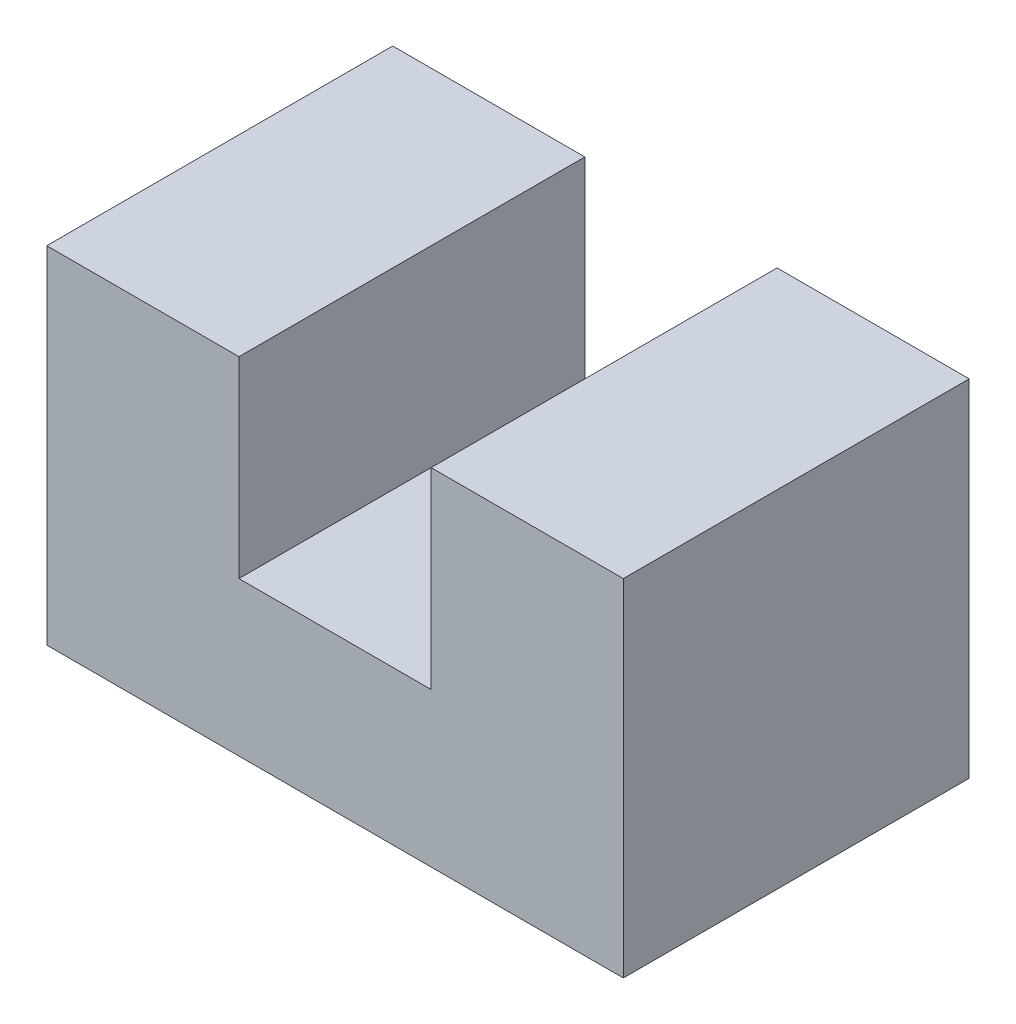
ISO-10303-21;
HEADER;
FILE_DESCRIPTION(('STEP AP214'),'2;1');
FILE_NAME('part.step','',(''),(''),'','','');
FILE_SCHEMA(('AUTOMOTIVE_DESIGN { 1 0 10303 214 1 1 1 1 }'));
ENDSEC;
DATA;
#1=APPLICATION_CONTEXT('core data for automotive mechanical design processes');
#2=APPLICATION_PROTOCOL_DEFINITION('international standard','automotive_design',2000,#1);
#3=PRODUCT_CONTEXT('',#1,'mechanical');
#4=PRODUCT('Part','Part','',(#3));
#5=PRODUCT_RELATED_PRODUCT_CATEGORY('part','',(#4));
#6=PRODUCT_DEFINITION_FORMATION('','',#4);
#7=PRODUCT_DEFINITION_CONTEXT('part definition',#1,'design');
#8=PRODUCT_DEFINITION('design','',#6,#7);
#9=PRODUCT_DEFINITION_SHAPE('','',#8);
#10=(LENGTH_UNIT() NAMED_UNIT(*) SI_UNIT(.MILLI.,.METRE.));
#11=(NAMED_UNIT(*) PLANE_ANGLE_UNIT() SI_UNIT($,.RADIAN.));
#12=(NAMED_UNIT(*) SI_UNIT($,.STERADIAN.) SOLID_ANGLE_UNIT());
#13=UNCERTAINTY_MEASURE_WITH_UNIT(LENGTH_MEASURE(1.E-05),#10,'distance_accuracy_value','');
#14=(GEOMETRIC_REPRESENTATION_CONTEXT(3) GLOBAL_UNCERTAINTY_ASSIGNED_CONTEXT((#13)) GLOBAL_UNIT_ASSIGNED_CONTEXT((#10,
#11,#12)) REPRESENTATION_CONTEXT('',''));
#15=CARTESIAN_POINT('',(0.,0.,0.));
#16=DIRECTION('',(0.,0.,1.));
#17=DIRECTION('',(1.,0.,0.));
#18=AXIS2_PLACEMENT_3D('',#15,#16,#17);
#19=CARTESIAN_POINT('',(0.,60.,30.));
#20=DIRECTION('',(1.,0.,0.));
#21=DIRECTION('',(0.,1.,0.));
#22=AXIS2_PLACEMENT_3D('',#19,#20,#21);
#23=PLANE('',#22);
#24=DIRECTION('',(0.,-1.,0.));
#25=VECTOR('',#24,1.);
#26=CARTESIAN_POINT('',(0.,60.,-30.));
#27=LINE('',#26,#25);
#28=CARTESIAN_POINT('',(0.,60.,-30.));
#29=VERTEX_POINT('',#28);
#30=CARTESIAN_POINT('',(0.,0.,-30.));
#31=VERTEX_POINT('',#30);
#32=EDGE_CURVE('E138',#29,#31,#27,.T.);
#33=ORIENTED_EDGE('',*,*,#32,.T.);
#34=DIRECTION('',(0.,0.,-1.));
#35=VECTOR('',#34,1.);
#36=CARTESIAN_POINT('',(0.,0.,30.));
#37=LINE('',#36,#35);
#38=CARTESIAN_POINT('',(0.,0.,30.));
#39=VERTEX_POINT('',#38);
#40=EDGE_CURVE('E11',#39,#31,#37,.T.);
#41=ORIENTED_EDGE('',*,*,#40,.F.);
#42=DIRECTION('',(0.,-1.,0.));
#43=VECTOR('',#42,1.);
#44=CARTESIAN_POINT('',(0.,60.,30.));
#45=LINE('',#44,#43);
#46=CARTESIAN_POINT('',(0.,60.,30.));
#47=VERTEX_POINT('',#46);
#48=EDGE_CURVE('E160',#47,#39,#45,.T.);
#49=ORIENTED_EDGE('',*,*,#48,.F.);
#50=DIRECTION('',(0.,0.,-1.));
#51=VECTOR('',#50,1.);
#52=CARTESIAN_POINT('',(0.,60.,30.));
#53=LINE('',#52,#51);
#54=EDGE_CURVE('E134',#47,#29,#53,.T.);
#55=ORIENTED_EDGE('',*,*,#54,.T.);
#56=EDGE_LOOP('',(#33,#41,#49,#55));
#57=FACE_BOUND('',#56,.T.);
#58=ADVANCED_FACE('F37',(#57),#23,.F.);
#59=CARTESIAN_POINT('',(0.,0.,30.));
#60=DIRECTION('',(0.,1.,0.));
#61=DIRECTION('',(0.,0.,1.));
#62=AXIS2_PLACEMENT_3D('',#59,#60,#61);
#63=PLANE('',#62);
#64=DIRECTION('',(1.,0.,0.));
#65=VECTOR('',#64,1.);
#66=CARTESIAN_POINT('',(0.,0.,-30.));
#67=LINE('',#66,#65);
#68=CARTESIAN_POINT('',(100.,0.,-30.));
#69=VERTEX_POINT('',#68);
#70=EDGE_CURVE('E142',#31,#69,#67,.T.);
#71=ORIENTED_EDGE('',*,*,#70,.T.);
#72=DIRECTION('',(0.,0.,-1.));
#73=VECTOR('',#72,1.);
#74=CARTESIAN_POINT('',(100.,0.,30.));
#75=LINE('',#74,#73);
#76=CARTESIAN_POINT('',(100.,0.,30.));
#77=VERTEX_POINT('',#76);
#78=EDGE_CURVE('E46',#77,#69,#75,.T.);
#79=ORIENTED_EDGE('',*,*,#78,.F.);
#80=DIRECTION('',(1.,0.,0.));
#81=VECTOR('',#80,1.);
#82=CARTESIAN_POINT('',(0.,0.,30.));
#83=LINE('',#82,#81);
#84=EDGE_CURVE('E97',#39,#77,#83,.T.);
#85=ORIENTED_EDGE('',*,*,#84,.F.);
#86=ORIENTED_EDGE('',*,*,#40,.T.);
#87=EDGE_LOOP('',(#71,#79,#85,#86));
#88=FACE_BOUND('',#87,.T.);
#89=ADVANCED_FACE('F206',(#88),#63,.F.);
#90=CARTESIAN_POINT('',(100.,0.,30.));
#91=DIRECTION('',(-1.,0.,0.));
#92=DIRECTION('',(0.,0.,1.));
#93=AXIS2_PLACEMENT_3D('',#90,#91,#92);
#94=PLANE('',#93);
#95=DIRECTION('',(0.,1.,0.));
#96=VECTOR('',#95,1.);
#97=CARTESIAN_POINT('',(100.,0.,-30.));
#98=LINE('',#97,#96);
#99=CARTESIAN_POINT('',(100.,60.,-30.));
#100=VERTEX_POINT('',#99);
#101=EDGE_CURVE('E145',#69,#100,#98,.T.);
#102=ORIENTED_EDGE('',*,*,#101,.T.);
#103=DIRECTION('',(0.,0.,-1.));
#104=VECTOR('',#103,1.);
#105=CARTESIAN_POINT('',(100.,60.,30.));
#106=LINE('',#105,#104);
#107=CARTESIAN_POINT('',(100.,60.,30.));
#108=VERTEX_POINT('',#107);
#109=EDGE_CURVE('E171',#108,#100,#106,.T.);
#110=ORIENTED_EDGE('',*,*,#109,.F.);
#111=DIRECTION('',(0.,1.,0.));
#112=VECTOR('',#111,1.);
#113=CARTESIAN_POINT('',(100.,0.,30.));
#114=LINE('',#113,#112);
#115=EDGE_CURVE('E181',#77,#108,#114,.T.);
#116=ORIENTED_EDGE('',*,*,#115,.F.);
#117=ORIENTED_EDGE('',*,*,#78,.T.);
#118=EDGE_LOOP('',(#102,#110,#116,#117));
#119=FACE_BOUND('',#118,.T.);
#120=ADVANCED_FACE('F179',(#119),#94,.F.);
#121=CARTESIAN_POINT('',(100.,60.,30.));
#122=DIRECTION('',(0.,-1.,0.));
#123=DIRECTION('',(0.,0.,-1.));
#124=AXIS2_PLACEMENT_3D('',#121,#122,#123);
#125=PLANE('',#124);
#126=DIRECTION('',(-1.,0.,0.));
#127=VECTOR('',#126,1.);
#128=CARTESIAN_POINT('',(100.,60.,-30.));
#129=LINE('',#128,#127);
#130=CARTESIAN_POINT('',(66.6666666666667,60.,-30.));
#131=VERTEX_POINT('',#130);
#132=EDGE_CURVE('E148',#100,#131,#129,.T.);
#133=ORIENTED_EDGE('',*,*,#132,.T.);
#134=DIRECTION('',(0.,0.,-1.));
#135=VECTOR('',#134,1.);
#136=CARTESIAN_POINT('',(66.6666666666667,60.,30.));
#137=LINE('',#136,#135);
#138=CARTESIAN_POINT('',(66.6666666666667,60.,30.));
#139=VERTEX_POINT('',#138);
#140=EDGE_CURVE('E167',#139,#131,#137,.T.);
#141=ORIENTED_EDGE('',*,*,#140,.F.);
#142=DIRECTION('',(-1.,0.,0.));
#143=VECTOR('',#142,1.);
#144=CARTESIAN_POINT('',(100.,60.,30.));
#145=LINE('',#144,#143);
#146=EDGE_CURVE('E194',#108,#139,#145,.T.);
#147=ORIENTED_EDGE('',*,*,#146,.F.);
#148=ORIENTED_EDGE('',*,*,#109,.T.);
#149=EDGE_LOOP('',(#133,#141,#147,#148));
#150=FACE_BOUND('',#149,.T.);
#151=ADVANCED_FACE('F189',(#150),#125,.F.);
#152=CARTESIAN_POINT('',(66.6666666666667,60.,30.));
#153=DIRECTION('',(1.,0.,0.));
#154=DIRECTION('',(0.,1.,0.));
#155=AXIS2_PLACEMENT_3D('',#152,#153,#154);
#156=PLANE('',#155);
#157=DIRECTION('',(0.,-1.,0.));
#158=VECTOR('',#157,1.);
#159=CARTESIAN_POINT('',(66.6666666666667,60.,-30.));
#160=LINE('',#159,#158);
#161=CARTESIAN_POINT('',(66.6666666666667,26.6666666666667,-30.));
#162=VERTEX_POINT('',#161);
#163=EDGE_CURVE('E151',#131,#162,#160,.T.);
#164=ORIENTED_EDGE('',*,*,#163,.T.);
#165=DIRECTION('',(0.,0.,-1.));
#166=VECTOR('',#165,1.);
#167=CARTESIAN_POINT('',(66.6666666666667,26.6666666666667,30.));
#168=LINE('',#167,#166);
#169=CARTESIAN_POINT('',(66.6666666666667,26.6666666666667,30.));
#170=VERTEX_POINT('',#169);
#171=EDGE_CURVE('E127',#170,#162,#168,.T.);
#172=ORIENTED_EDGE('',*,*,#171,.F.);
#173=DIRECTION('',(0.,-1.,0.));
#174=VECTOR('',#173,1.);
#175=CARTESIAN_POINT('',(66.6666666666667,60.,30.));
#176=LINE('',#175,#174);
#177=EDGE_CURVE('E116',#139,#170,#176,.T.);
#178=ORIENTED_EDGE('',*,*,#177,.F.);
#179=ORIENTED_EDGE('',*,*,#140,.T.);
#180=EDGE_LOOP('',(#164,#172,#178,#179));
#181=FACE_BOUND('',#180,.T.);
#182=ADVANCED_FACE('F192',(#181),#156,.F.);
#183=CARTESIAN_POINT('',(66.6666666666667,26.6666666666667,30.));
#184=DIRECTION('',(0.,-1.,0.));
#185=DIRECTION('',(0.,0.,-1.));
#186=AXIS2_PLACEMENT_3D('',#183,#184,#185);
#187=PLANE('',#186);
#188=DIRECTION('',(-1.,0.,0.));
#189=VECTOR('',#188,1.);
#190=CARTESIAN_POINT('',(66.6666666666667,26.6666666666667,-30.));
#191=LINE('',#190,#189);
#192=CARTESIAN_POINT('',(33.3333333333333,26.6666666666667,-30.));
#193=VERTEX_POINT('',#192);
#194=EDGE_CURVE('E125',#162,#193,#191,.T.);
#195=ORIENTED_EDGE('',*,*,#194,.T.);
#196=DIRECTION('',(0.,0.,-1.));
#197=VECTOR('',#196,1.);
#198=CARTESIAN_POINT('',(33.3333333333333,26.6666666666667,30.));
#199=LINE('',#198,#197);
#200=CARTESIAN_POINT('',(33.3333333333333,26.6666666666667,30.));
#201=VERTEX_POINT('',#200);
#202=EDGE_CURVE('E122',#201,#193,#199,.T.);
#203=ORIENTED_EDGE('',*,*,#202,.F.);
#204=DIRECTION('',(-1.,0.,0.));
#205=VECTOR('',#204,1.);
#206=CARTESIAN_POINT('',(66.6666666666667,26.6666666666667,30.));
#207=LINE('',#206,#205);
#208=EDGE_CURVE('E110',#170,#201,#207,.T.);
#209=ORIENTED_EDGE('',*,*,#208,.F.);
#210=ORIENTED_EDGE('',*,*,#171,.T.);
#211=EDGE_LOOP('',(#195,#203,#209,#210));
#212=FACE_BOUND('',#211,.T.);
#213=ADVANCED_FACE('F123',(#212),#187,.F.);
#214=CARTESIAN_POINT('',(33.3333333333333,26.6666666666667,30.));
#215=DIRECTION('',(-1.,0.,0.));
#216=DIRECTION('',(0.,-1.,0.));
#217=AXIS2_PLACEMENT_3D('',#214,#215,#216);
#218=PLANE('',#217);
#219=DIRECTION('',(0.,1.,0.));
#220=VECTOR('',#219,1.);
#221=CARTESIAN_POINT('',(33.3333333333333,26.6666666666667,-30.));
#222=LINE('',#221,#220);
#223=CARTESIAN_POINT('',(33.3333333333333,60.,-30.));
#224=VERTEX_POINT('',#223);
#225=EDGE_CURVE('E83',#193,#224,#222,.T.);
#226=ORIENTED_EDGE('',*,*,#225,.T.);
#227=DIRECTION('',(0.,0.,-1.));
#228=VECTOR('',#227,1.);
#229=CARTESIAN_POINT('',(33.3333333333333,60.,30.));
#230=LINE('',#229,#228);
#231=CARTESIAN_POINT('',(33.3333333333333,60.,30.));
#232=VERTEX_POINT('',#231);
#233=EDGE_CURVE('E128',#232,#224,#230,.T.);
#234=ORIENTED_EDGE('',*,*,#233,.F.);
#235=DIRECTION('',(0.,1.,0.));
#236=VECTOR('',#235,1.);
#237=CARTESIAN_POINT('',(33.3333333333333,26.6666666666667,30.));
#238=LINE('',#237,#236);
#239=EDGE_CURVE('E114',#201,#232,#238,.T.);
#240=ORIENTED_EDGE('',*,*,#239,.F.);
#241=ORIENTED_EDGE('',*,*,#202,.T.);
#242=EDGE_LOOP('',(#226,#234,#240,#241));
#243=FACE_BOUND('',#242,.T.);
#244=ADVANCED_FACE('F130',(#243),#218,.F.);
#245=CARTESIAN_POINT('',(33.3333333333333,60.,30.));
#246=DIRECTION('',(0.,-1.,0.));
#247=DIRECTION('',(1.,0.,0.));
#248=AXIS2_PLACEMENT_3D('',#245,#246,#247);
#249=PLANE('',#248);
#250=DIRECTION('',(-1.,0.,0.));
#251=VECTOR('',#250,1.);
#252=CARTESIAN_POINT('',(33.3333333333333,60.,-30.));
#253=LINE('',#252,#251);
#254=EDGE_CURVE('E89',#224,#29,#253,.T.);
#255=ORIENTED_EDGE('',*,*,#254,.T.);
#256=ORIENTED_EDGE('',*,*,#54,.F.);
#257=DIRECTION('',(-1.,0.,0.));
#258=VECTOR('',#257,1.);
#259=CARTESIAN_POINT('',(33.3333333333333,60.,30.));
#260=LINE('',#259,#258);
#261=EDGE_CURVE('E54',#232,#47,#260,.T.);
#262=ORIENTED_EDGE('',*,*,#261,.F.);
#263=ORIENTED_EDGE('',*,*,#233,.T.);
#264=EDGE_LOOP('',(#255,#256,#262,#263));
#265=FACE_BOUND('',#264,.T.);
#266=ADVANCED_FACE('F222',(#265),#249,.F.);
#267=CARTESIAN_POINT('',(0.,0.,30.));
#268=DIRECTION('',(0.,0.,1.));
#269=DIRECTION('',(1.,0.,0.));
#270=AXIS2_PLACEMENT_3D('',#267,#268,#269);
#271=PLANE('',#270);
#272=ORIENTED_EDGE('',*,*,#48,.T.);
#273=ORIENTED_EDGE('',*,*,#84,.T.);
#274=ORIENTED_EDGE('',*,*,#115,.T.);
#275=ORIENTED_EDGE('',*,*,#146,.T.);
#276=ORIENTED_EDGE('',*,*,#177,.T.);
#277=ORIENTED_EDGE('',*,*,#208,.T.);
#278=ORIENTED_EDGE('',*,*,#239,.T.);
#279=ORIENTED_EDGE('',*,*,#261,.T.);
#280=EDGE_LOOP('',(#272,#273,#274,#275,#276,#277,#278,#279));
#281=FACE_BOUND('',#280,.T.);
#282=ADVANCED_FACE('F112',(#281),#271,.T.);
#283=CARTESIAN_POINT('',(0.,0.,-30.));
#284=DIRECTION('',(0.,0.,1.));
#285=DIRECTION('',(1.,0.,0.));
#286=AXIS2_PLACEMENT_3D('',#283,#284,#285);
#287=PLANE('',#286);
#288=ORIENTED_EDGE('',*,*,#32,.F.);
#289=ORIENTED_EDGE('',*,*,#254,.F.);
#290=ORIENTED_EDGE('',*,*,#225,.F.);
#291=ORIENTED_EDGE('',*,*,#194,.F.);
#292=ORIENTED_EDGE('',*,*,#163,.F.);
#293=ORIENTED_EDGE('',*,*,#132,.F.);
#294=ORIENTED_EDGE('',*,*,#101,.F.);
#295=ORIENTED_EDGE('',*,*,#70,.F.);
#296=EDGE_LOOP('',(#288,#289,#290,#291,#292,#293,#294,#295));
#297=FACE_BOUND('',#296,.T.);
#298=ADVANCED_FACE('F185',(#297),#287,.F.);
#299=CLOSED_SHELL('',(#58,#89,#120,#151,#182,#213,#244,#266,#282,#298));
#300=MANIFOLD_SOLID_BREP('B2',#299);
#301=ADVANCED_BREP_SHAPE_REPRESENTATION('',(#18,#300),#14);
#302=SHAPE_DEFINITION_REPRESENTATION(#9,#301);
ENDSEC;
END-ISO-10303-21;
